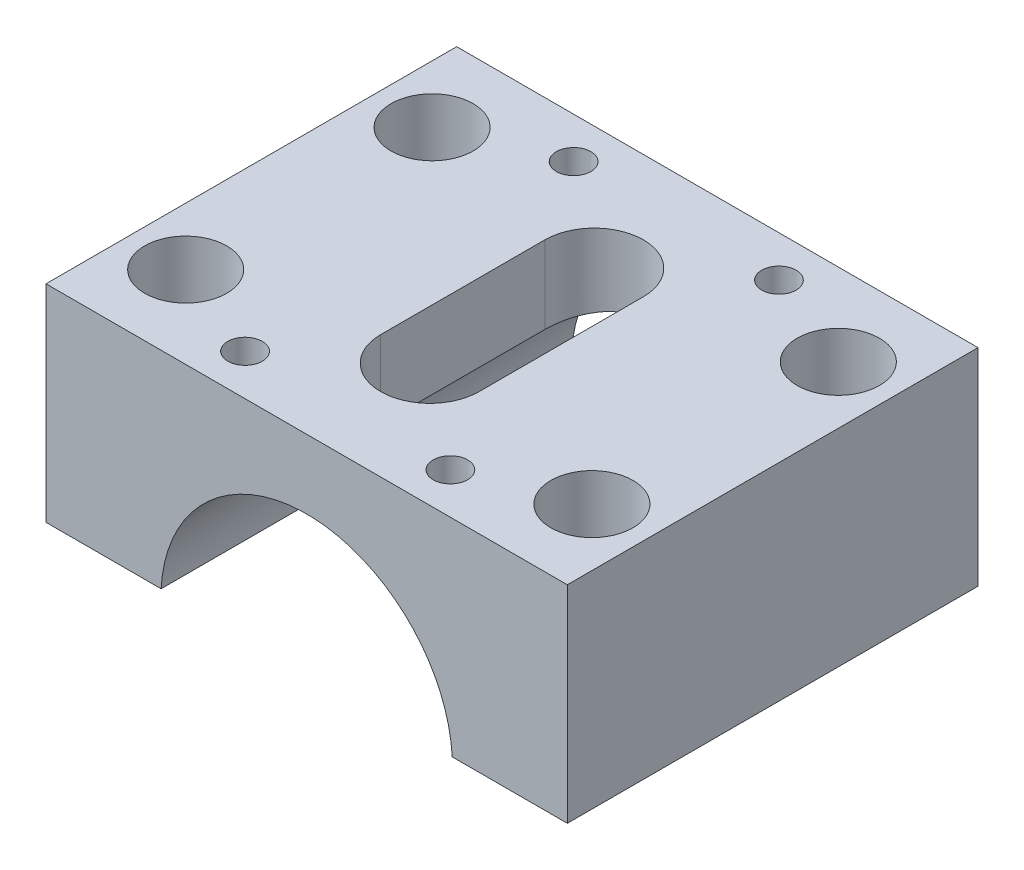
ISO-10303-21;
HEADER;
FILE_DESCRIPTION(('STEP AP214'),'2;1');
FILE_NAME('part.step','',(''),(''),'','','');
FILE_SCHEMA(('AUTOMOTIVE_DESIGN { 1 0 10303 214 1 1 1 1 }'));
ENDSEC;
DATA;
#1=APPLICATION_CONTEXT('core data for automotive mechanical design processes');
#2=APPLICATION_PROTOCOL_DEFINITION('international standard','automotive_design',2000,#1);
#3=PRODUCT_CONTEXT('',#1,'mechanical');
#4=PRODUCT('Part','Part','',(#3));
#5=PRODUCT_RELATED_PRODUCT_CATEGORY('part','',(#4));
#6=PRODUCT_DEFINITION_FORMATION('','',#4);
#7=PRODUCT_DEFINITION_CONTEXT('part definition',#1,'design');
#8=PRODUCT_DEFINITION('design','',#6,#7);
#9=PRODUCT_DEFINITION_SHAPE('','',#8);
#10=(LENGTH_UNIT() NAMED_UNIT(*) SI_UNIT(.MILLI.,.METRE.));
#11=(NAMED_UNIT(*) PLANE_ANGLE_UNIT() SI_UNIT($,.RADIAN.));
#12=(NAMED_UNIT(*) SI_UNIT($,.STERADIAN.) SOLID_ANGLE_UNIT());
#13=UNCERTAINTY_MEASURE_WITH_UNIT(LENGTH_MEASURE(1.E-05),#10,'distance_accuracy_value','');
#14=(GEOMETRIC_REPRESENTATION_CONTEXT(3) GLOBAL_UNCERTAINTY_ASSIGNED_CONTEXT((#13)) GLOBAL_UNIT_ASSIGNED_CONTEXT((#10,
#11,#12)) REPRESENTATION_CONTEXT('',''));
#15=CARTESIAN_POINT('',(0.,0.,0.));
#16=DIRECTION('',(0.,0.,1.));
#17=DIRECTION('',(1.,0.,0.));
#18=AXIS2_PLACEMENT_3D('',#15,#16,#17);
#19=CARTESIAN_POINT('',(-31.734248061046,1.,50.));
#20=DIRECTION('',(0.,1.,0.));
#21=DIRECTION('',(0.,0.,1.));
#22=AXIS2_PLACEMENT_3D('',#19,#20,#21);
#23=PLANE('',#22);
#24=CARTESIAN_POINT('',(-24.7280283297466,1.,10.));
#25=DIRECTION('',(0.,-1.,0.));
#26=DIRECTION('',(0.,0.,-1.));
#27=AXIS2_PLACEMENT_3D('',#24,#25,#26);
#28=CIRCLE('',#27,2.5);
#29=CARTESIAN_POINT('',(-24.7280283297466,1.,7.5));
#30=VERTEX_POINT('',#29);
#31=EDGE_CURVE('E382',#30,#30,#28,.T.);
#32=ORIENTED_EDGE('',*,*,#31,.F.);
#33=EDGE_LOOP('',(#32));
#34=FACE_BOUND('',#33,.T.);
#35=DIRECTION('',(1.,0.,0.));
#36=VECTOR('',#35,1.);
#37=CARTESIAN_POINT('',(-31.734248061046,1.,0.));
#38=LINE('',#37,#36);
#39=CARTESIAN_POINT('',(-31.734248061046,1.,0.));
#40=VERTEX_POINT('',#39);
#41=CARTESIAN_POINT('',(-17.7218085984473,0.999999999999997,0.));
#42=VERTEX_POINT('',#41);
#43=EDGE_CURVE('E339',#40,#42,#38,.T.);
#44=ORIENTED_EDGE('',*,*,#43,.T.);
#45=DIRECTION('',(0.,0.,-1.));
#46=VECTOR('',#45,1.);
#47=CARTESIAN_POINT('',(-17.7218085984473,0.999999999999997,50.));
#48=LINE('',#47,#46);
#49=CARTESIAN_POINT('',(-17.7218085984473,0.999999999999997,50.));
#50=VERTEX_POINT('',#49);
#51=EDGE_CURVE('E335',#50,#42,#48,.T.);
#52=ORIENTED_EDGE('',*,*,#51,.F.);
#53=DIRECTION('',(1.,0.,0.));
#54=VECTOR('',#53,1.);
#55=CARTESIAN_POINT('',(-31.734248061046,1.,50.));
#56=LINE('',#55,#54);
#57=CARTESIAN_POINT('',(-31.734248061046,1.,50.));
#58=VERTEX_POINT('',#57);
#59=EDGE_CURVE('E351',#58,#50,#56,.T.);
#60=ORIENTED_EDGE('',*,*,#59,.F.);
#61=DIRECTION('',(0.,0.,-1.));
#62=VECTOR('',#61,1.);
#63=CARTESIAN_POINT('',(-31.734248061046,1.,50.));
#64=LINE('',#63,#62);
#65=EDGE_CURVE('E67',#58,#40,#64,.T.);
#66=ORIENTED_EDGE('',*,*,#65,.T.);
#67=EDGE_LOOP('',(#44,#52,#60,#66));
#68=FACE_BOUND('',#67,.T.);
#69=CARTESIAN_POINT('',(-24.7280283297466,1.,40.));
#70=DIRECTION('',(0.,-1.,0.));
#71=DIRECTION('',(0.,0.,-1.));
#72=AXIS2_PLACEMENT_3D('',#69,#70,#71);
#73=CIRCLE('',#72,2.5);
#74=CARTESIAN_POINT('',(-24.7280283297466,1.,37.5));
#75=VERTEX_POINT('',#74);
#76=EDGE_CURVE('E385',#75,#75,#73,.T.);
#77=ORIENTED_EDGE('',*,*,#76,.F.);
#78=EDGE_LOOP('',(#77));
#79=FACE_BOUND('',#78,.T.);
#80=ADVANCED_FACE('F59',(#34,#68,#79),#23,.F.);
#81=CARTESIAN_POINT('',(0.,0.,50.));
#82=DIRECTION('',(0.,0.,-1.));
#83=DIRECTION('',(-1.,0.,0.));
#84=AXIS2_PLACEMENT_3D('',#81,#82,#83);
#85=CYLINDRICAL_SURFACE('',#84,17.75);
#86=DIRECTION('',(0.,0.,-1.));
#87=VECTOR('',#86,1.);
#88=CARTESIAN_POINT('',(-6.,16.7051638722881,50.));
#89=LINE('',#88,#87);
#90=CARTESIAN_POINT('',(-6.,16.7051638722881,35.));
#91=VERTEX_POINT('',#90);
#92=CARTESIAN_POINT('',(-6.,16.7051638722881,15.));
#93=VERTEX_POINT('',#92);
#94=EDGE_CURVE('E325',#91,#93,#89,.T.);
#95=ORIENTED_EDGE('',*,*,#94,.F.);
#96=CARTESIAN_POINT('',(6.,16.7051638722881,35.));
#97=CARTESIAN_POINT('',(6.00002342007143,16.7051365414949,35.1635480674207));
#98=CARTESIAN_POINT('',(5.99331409026112,16.7075647258007,35.3270857677742));
#99=CARTESIAN_POINT('',(5.96660432457967,16.7171320030722,35.652889514839));
#100=CARTESIAN_POINT('',(5.9466075678763,16.7242697919873,35.8151559009854));
#101=CARTESIAN_POINT('',(5.89357724858138,16.7430280345512,36.1367722796383));
#102=CARTESIAN_POINT('',(5.86058318341207,16.754634904753,36.2961295914589));
#103=CARTESIAN_POINT('',(5.78187292592793,16.7819602677661,36.6113118511021));
#104=CARTESIAN_POINT('',(5.73615625437459,16.7976789154596,36.7671366656224));
#105=CARTESIAN_POINT('',(5.63244556957572,16.8327372666503,37.0740731154286));
#106=CARTESIAN_POINT('',(5.5744618826778,16.8520739229428,37.225188593033));
#107=CARTESIAN_POINT('',(5.44664238090107,16.8938185798991,37.5219432584875));
#108=CARTESIAN_POINT('',(5.37680214225187,16.91622772633,37.6675803774535));
#109=CARTESIAN_POINT('',(5.22578838635883,16.963487061155,37.9524795941462));
#110=CARTESIAN_POINT('',(5.14461229712971,16.988337803141,38.0917402355688));
#111=CARTESIAN_POINT('',(4.97146486025809,17.0398120576225,38.363101586681));
#112=CARTESIAN_POINT('',(4.87948962832843,17.0664362064864,38.4951996949894));
#113=CARTESIAN_POINT('',(4.68183431450372,17.1217356884626,38.7560842050773));
#114=CARTESIAN_POINT('',(4.57577885881734,17.1504503813225,38.8845780067753));
#115=CARTESIAN_POINT('',(4.35340058577292,17.2082421789065,39.1322639179705));
#116=CARTESIAN_POINT('',(4.23707756316293,17.2373192908655,39.2514558414303));
#117=CARTESIAN_POINT('',(3.99483022450528,17.2950668741335,39.4798495696576));
#118=CARTESIAN_POINT('',(3.86890253979927,17.323737198549,39.5890478395198));
#119=CARTESIAN_POINT('',(3.60828257109103,17.3798894537477,39.7966701841972));
#120=CARTESIAN_POINT('',(3.47359335570537,17.4073717950536,39.8950979991787));
#121=CARTESIAN_POINT('',(3.19241700567326,17.4611572897031,40.0830945540191));
#122=CARTESIAN_POINT('',(3.04570771927342,17.4874074957652,40.1723466336045));
#123=CARTESIAN_POINT('',(2.74487413756477,17.5371433474165,40.3380844595887));
#124=CARTESIAN_POINT('',(2.59075285195165,17.5606301019936,40.4145753323143));
#125=CARTESIAN_POINT('',(2.27607126811911,17.6041821829219,40.554199575868));
#126=CARTESIAN_POINT('',(2.11550990140112,17.6242469385915,40.6173307191363));
#127=CARTESIAN_POINT('',(1.78920718040851,17.6603557164245,40.7296153246076));
#128=CARTESIAN_POINT('',(1.62346819757881,17.6764015498211,40.7787750847327));
#129=CARTESIAN_POINT('',(1.2939370559646,17.7035190514898,40.8611898531046));
#130=CARTESIAN_POINT('',(1.13028273867241,17.7147463284741,40.8949450909246));
#131=CARTESIAN_POINT('',(0.80055135890321,17.7327060439557,40.9486979167892));
#132=CARTESIAN_POINT('',(0.634475324305889,17.7394403358044,40.9687011776123));
#133=CARTESIAN_POINT('',(0.301111376380601,17.7482290372184,40.9947714589517));
#134=CARTESIAN_POINT('',(0.133823478621162,17.7502835067979,41.0008386581841));
#135=CARTESIAN_POINT('',(-0.200663382374875,17.7496535695884,40.9989751915117));
#136=CARTESIAN_POINT('',(-0.367862347639956,17.7469692759697,40.9910448598939));
#137=CARTESIAN_POINT('',(-0.694112668740136,17.7371434247946,40.9618733934276));
#138=CARTESIAN_POINT('',(-0.853219423674938,17.7301870755693,40.9411852081814));
#139=CARTESIAN_POINT('',(-1.16909348858325,17.7121640102108,40.8871811408754));
#140=CARTESIAN_POINT('',(-1.32585998992614,17.7010959060361,40.8538609944546));
#141=CARTESIAN_POINT('',(-1.63587502360733,17.6751408316399,40.7749018680635));
#142=CARTESIAN_POINT('',(-1.78912472668508,17.6602551529835,40.7292670541304));
#143=CARTESIAN_POINT('',(-2.09121751486416,17.6270363851067,40.6260376134251));
#144=CARTESIAN_POINT('',(-2.24005891220177,17.6087019947665,40.5684384719286));
#145=CARTESIAN_POINT('',(-2.53424365067538,17.5687913601538,40.4409229677589));
#146=CARTESIAN_POINT('',(-2.67951670042951,17.5471761971275,40.3708567117232));
#147=CARTESIAN_POINT('',(-2.96369547934685,17.5014208689384,40.219429228615));
#148=CARTESIAN_POINT('',(-3.10259900868277,17.4772798407298,40.1380641377931));
#149=CARTESIAN_POINT('',(-3.37318788302114,17.4270778264192,39.964617888958));
#150=CARTESIAN_POINT('',(-3.50487282999016,17.40101673463,39.8725361408997));
#151=CARTESIAN_POINT('',(-3.76027934111379,17.3476172519324,39.6782525140165));
#152=CARTESIAN_POINT('',(-3.88400060689633,17.3202788132324,39.5760502563741));
#153=CARTESIAN_POINT('',(-4.12858069572515,17.2636564200596,39.3569560161169));
#154=CARTESIAN_POINT('',(-4.24901026058293,17.2343423867391,39.2395921780816));
#155=CARTESIAN_POINT('',(-4.4795771268587,17.1758561337556,38.9951975716192));
#156=CARTESIAN_POINT('',(-4.58971762724468,17.1466838727062,38.8681698302272));
#157=CARTESIAN_POINT('',(-4.7991210603441,17.0892578880068,38.6050963977285));
#158=CARTESIAN_POINT('',(-4.89837631781216,17.0610048222342,38.4690444507081));
#159=CARTESIAN_POINT('',(-5.08520781892287,17.0062528863796,38.1888867436865));
#160=CARTESIAN_POINT('',(-5.17278861712651,16.9797533342425,38.0447841558055));
#161=CARTESIAN_POINT('',(-5.33697878779275,16.928870806327,37.7470028158934));
#162=CARTESIAN_POINT('',(-5.41338988724082,16.9045285462766,37.5932076240204));
#163=CARTESIAN_POINT('',(-5.55287251715026,16.8592255234493,37.2792752014284));
#164=CARTESIAN_POINT('',(-5.6159496138666,16.8382633505314,37.1191406503401));
#165=CARTESIAN_POINT('',(-5.72816785783277,16.8004197208411,36.7937864930715));
#166=CARTESIAN_POINT('',(-5.7773242610427,16.7835337998442,36.6285726752941));
#167=CARTESIAN_POINT('',(-5.86129010281429,16.7543948139634,36.2942095086042));
#168=CARTESIAN_POINT('',(-5.89610608361684,16.7421396367004,36.1250619915753));
#169=CARTESIAN_POINT('',(-5.94898531422032,16.7234218880272,35.7969109803414));
#170=CARTESIAN_POINT('',(-5.9681095355349,16.7165936842612,35.6380986103494));
#171=CARTESIAN_POINT('',(-5.9936190489736,16.7074552873122,35.3195282200375));
#172=CARTESIAN_POINT('',(-6.00002036822412,16.7051394099935,35.1597716440503));
#173=CARTESIAN_POINT('',(-6.,16.7051638722881,35.));
#174=B_SPLINE_CURVE_WITH_KNOTS('',3,(#96,#97,#98,#99,#100,#101,#102,#103,#104,#105,#106,#107,
#108,#109,#110,#111,#112,#113,#114,#115,#116,#117,#118,#119,#120,#121,#122,#123,#124,#125,#126,
#127,#128,#129,#130,#131,#132,#133,#134,#135,#136,#137,#138,#139,#140,#141,#142,#143,#144,#145,
#146,#147,#148,#149,#150,#151,#152,#153,#154,#155,#156,#157,#158,#159,#160,#161,#162,#163,#164,
#165,#166,#167,#168,#169,#170,#171,#172,#173),.UNSPECIFIED.,.F.,.F.,(4,2,2,2,2,2,2,2,2,2,2,2,2,
2,2,2,2,2,2,2,2,2,2,2,2,2,2,2,2,2,2,2,2,2,2,2,2,2,4),(0.,0.490472545918875,0.98080934100671,
1.4696674100072,1.95854389593631,2.4470104726231,2.93565970209931,3.42441998162882,
3.91335660245956,4.41997790163518,4.92660933062793,5.43341927568454,5.94005266276983,
6.46056872703177,6.98087518775703,7.50126833453608,8.02142652872063,8.5232210755085,
9.0248085044319,9.52638950096331,10.0279585189793,10.5091832820183,10.9905706442039,
11.4717953573418,11.9532019909966,12.4408448359006,12.9286548476749,13.4164917303464,
13.9043468799818,14.4158435133775,14.9271805846104,15.4388759152851,15.9503710301442,
16.4700615590999,16.9895347139059,17.5084363451177,18.0271009854307,18.5068497362949,
18.9859937603852),.UNSPECIFIED.);
#175=CARTESIAN_POINT('',(6.,16.7051638722881,35.));
#176=VERTEX_POINT('',#175);
#177=EDGE_CURVE('E229',#176,#91,#174,.T.);
#178=ORIENTED_EDGE('',*,*,#177,.F.);
#179=DIRECTION('',(0.,0.,-1.));
#180=VECTOR('',#179,1.);
#181=CARTESIAN_POINT('',(6.,16.7051638722881,50.));
#182=LINE('',#181,#180);
#183=CARTESIAN_POINT('',(6.,16.7051638722881,15.));
#184=VERTEX_POINT('',#183);
#185=EDGE_CURVE('E217',#184,#176,#182,.F.);
#186=ORIENTED_EDGE('',*,*,#185,.F.);
#187=CARTESIAN_POINT('',(-6.,16.7051638722881,15.));
#188=CARTESIAN_POINT('',(-6.00002342007143,16.7051365414949,14.8364519325793));
#189=CARTESIAN_POINT('',(-5.99331409026111,16.7075647258007,14.6729142322258));
#190=CARTESIAN_POINT('',(-5.96660432457967,16.7171320030722,14.347110485161));
#191=CARTESIAN_POINT('',(-5.9466075678763,16.7242697919873,14.1848440990146));
#192=CARTESIAN_POINT('',(-5.89357724858138,16.7430280345512,13.8632277203617));
#193=CARTESIAN_POINT('',(-5.86058318341206,16.754634904753,13.7038704085411));
#194=CARTESIAN_POINT('',(-5.78187292592793,16.7819602677661,13.3886881488979));
#195=CARTESIAN_POINT('',(-5.73615625437459,16.7976789154596,13.2328633343776));
#196=CARTESIAN_POINT('',(-5.63244556957572,16.8327372666503,12.9259268845714));
#197=CARTESIAN_POINT('',(-5.5744618826778,16.8520739229428,12.774811406967));
#198=CARTESIAN_POINT('',(-5.44664238090107,16.8938185798991,12.4780567415125));
#199=CARTESIAN_POINT('',(-5.37680214225186,16.91622772633,12.3324196225465));
#200=CARTESIAN_POINT('',(-5.22578838635882,16.963487061155,12.0475204058538));
#201=CARTESIAN_POINT('',(-5.14461229712971,16.988337803141,11.9082597644312));
#202=CARTESIAN_POINT('',(-4.97146486025808,17.0398120576225,11.636898413319));
#203=CARTESIAN_POINT('',(-4.87948962832842,17.0664362064864,11.5048003050106));
#204=CARTESIAN_POINT('',(-4.68183431450372,17.1217356884626,11.2439157949228));
#205=CARTESIAN_POINT('',(-4.57577885881734,17.1504503813225,11.1154219932247));
#206=CARTESIAN_POINT('',(-4.35340058577292,17.2082421789065,10.8677360820295));
#207=CARTESIAN_POINT('',(-4.23707756316292,17.2373192908655,10.7485441585697));
#208=CARTESIAN_POINT('',(-3.99483022450527,17.2950668741335,10.5201504303424));
#209=CARTESIAN_POINT('',(-3.86890253979926,17.323737198549,10.4109521604802));
#210=CARTESIAN_POINT('',(-3.60828257109102,17.3798894537477,10.2033298158028));
#211=CARTESIAN_POINT('',(-3.47359335570536,17.4073717950536,10.1049020008213));
#212=CARTESIAN_POINT('',(-3.19241700567326,17.4611572897031,9.91690544598085));
#213=CARTESIAN_POINT('',(-3.04570771927341,17.4874074957652,9.82765336639554));
#214=CARTESIAN_POINT('',(-2.74487413756477,17.5371433474165,9.66191554041129));
#215=CARTESIAN_POINT('',(-2.59075285195164,17.5606301019936,9.58542466768575));
#216=CARTESIAN_POINT('',(-2.2760712681191,17.6041821829219,9.44580042413195));
#217=CARTESIAN_POINT('',(-2.11550990140111,17.6242469385915,9.38266928086366));
#218=CARTESIAN_POINT('',(-1.7892071804085,17.6603557164245,9.27038467539244));
#219=CARTESIAN_POINT('',(-1.62346819757881,17.6764015498211,9.22122491526731));
#220=CARTESIAN_POINT('',(-1.29393705596459,17.7035190514898,9.13881014689541));
#221=CARTESIAN_POINT('',(-1.1302827386724,17.7147463284741,9.10505490907543));
#222=CARTESIAN_POINT('',(-0.800551358903203,17.7327060439557,9.05130208321085));
#223=CARTESIAN_POINT('',(-0.634475324305883,17.7394403358044,9.03129882238769));
#224=CARTESIAN_POINT('',(-0.301111376380595,17.7482290372184,9.00522854104826));
#225=CARTESIAN_POINT('',(-0.133823478621156,17.7502835067979,8.99916134181595));
#226=CARTESIAN_POINT('',(0.200663382374881,17.7496535695884,9.00102480848829));
#227=CARTESIAN_POINT('',(0.367862347639962,17.7469692759697,9.00895514010612));
#228=CARTESIAN_POINT('',(0.694112668740141,17.7371434247946,9.03812660657236));
#229=CARTESIAN_POINT('',(0.853219423674942,17.7301870755693,9.05881479181859));
#230=CARTESIAN_POINT('',(1.16909348858325,17.7121640102108,9.11281885912462));
#231=CARTESIAN_POINT('',(1.32585998992615,17.7010959060361,9.14613900554543));
#232=CARTESIAN_POINT('',(1.63587502360733,17.6751408316399,9.22509813193652));
#233=CARTESIAN_POINT('',(1.78912472668509,17.6602551529835,9.27073294586959));
#234=CARTESIAN_POINT('',(2.09121751486416,17.6270363851067,9.37396238657486));
#235=CARTESIAN_POINT('',(2.24005891220178,17.6087019947665,9.43156152807137));
#236=CARTESIAN_POINT('',(2.53424365067538,17.5687913601538,9.55907703224106));
#237=CARTESIAN_POINT('',(2.67951670042951,17.5471761971275,9.6291432882768));
#238=CARTESIAN_POINT('',(2.96369547934686,17.5014208689383,9.78057077138503));
#239=CARTESIAN_POINT('',(3.10259900868277,17.4772798407298,9.86193586220694));
#240=CARTESIAN_POINT('',(3.37318788302114,17.4270778264192,10.035382111042));
#241=CARTESIAN_POINT('',(3.50487282999016,17.40101673463,10.1274638591003));
#242=CARTESIAN_POINT('',(3.76027934111379,17.3476172519324,10.3217474859835));
#243=CARTESIAN_POINT('',(3.88400060689633,17.3202788132324,10.4239497436259));
#244=CARTESIAN_POINT('',(4.12858069572516,17.2636564200596,10.6430439838831));
#245=CARTESIAN_POINT('',(4.24901026058293,17.2343423867391,10.7604078219184));
#246=CARTESIAN_POINT('',(4.4795771268587,17.1758561337556,11.0048024283808));
#247=CARTESIAN_POINT('',(4.58971762724468,17.1466838727062,11.1318301697728));
#248=CARTESIAN_POINT('',(4.7991210603441,17.0892578880068,11.3949036022715));
#249=CARTESIAN_POINT('',(4.89837631781216,17.0610048222342,11.5309555492919));
#250=CARTESIAN_POINT('',(5.08520781892287,17.0062528863796,11.8111132563135));
#251=CARTESIAN_POINT('',(5.17278861712651,16.9797533342425,11.9552158441945));
#252=CARTESIAN_POINT('',(5.33697878779275,16.928870806327,12.2529971841066));
#253=CARTESIAN_POINT('',(5.41338988724082,16.9045285462766,12.4067923759796));
#254=CARTESIAN_POINT('',(5.55287251715026,16.8592255234493,12.7207247985716));
#255=CARTESIAN_POINT('',(5.6159496138666,16.8382633505314,12.88085934966));
#256=CARTESIAN_POINT('',(5.72816785783278,16.8004197208411,13.2062135069285));
#257=CARTESIAN_POINT('',(5.77732426104271,16.7835337998442,13.3714273247059));
#258=CARTESIAN_POINT('',(5.86129010281429,16.7543948139634,13.7057904913958));
#259=CARTESIAN_POINT('',(5.89610608361684,16.7421396367004,13.8749380084247));
#260=CARTESIAN_POINT('',(5.94898531422033,16.7234218880272,14.2030890196586));
#261=CARTESIAN_POINT('',(5.96810953553491,16.7165936842612,14.3619013896507));
#262=CARTESIAN_POINT('',(5.9936190489736,16.7074552873122,14.6804717799625));
#263=CARTESIAN_POINT('',(6.00002036822413,16.7051394099935,14.8402283559497));
#264=CARTESIAN_POINT('',(6.,16.7051638722881,15.));
#265=B_SPLINE_CURVE_WITH_KNOTS('',3,(#187,#188,#189,#190,#191,#192,#193,#194,#195,#196,#197,
#198,#199,#200,#201,#202,#203,#204,#205,#206,#207,#208,#209,#210,#211,#212,#213,#214,#215,#216,
#217,#218,#219,#220,#221,#222,#223,#224,#225,#226,#227,#228,#229,#230,#231,#232,#233,#234,#235,
#236,#237,#238,#239,#240,#241,#242,#243,#244,#245,#246,#247,#248,#249,#250,#251,#252,#253,#254,
#255,#256,#257,#258,#259,#260,#261,#262,#263,#264),.UNSPECIFIED.,.F.,.F.,(4,2,2,2,2,2,2,2,2,2,2,
2,2,2,2,2,2,2,2,2,2,2,2,2,2,2,2,2,2,2,2,2,2,2,2,2,2,2,4),(0.,0.49047254591887,0.98080934100671,
1.4696674100072,1.95854389593631,2.4470104726231,2.93565970209932,3.42441998162883,
3.91335660245955,4.41997790163518,4.92660933062793,5.43341927568454,5.94005266276983,
6.46056872703178,6.98087518775703,7.50126833453609,8.02142652872063,8.5232210755085,
9.02480850443191,9.52638950096331,10.0279585189793,10.5091832820183,10.9905706442039,
11.4717953573418,11.9532019909966,12.4408448359006,12.9286548476749,13.4164917303464,
13.9043468799818,14.4158435133775,14.9271805846104,15.4388759152851,15.9503710301442,
16.4700615590999,16.9895347139059,17.5084363451177,18.0271009854307,18.5068497362949,
18.9859937603852),.UNSPECIFIED.);
#266=EDGE_CURVE('E208',#93,#184,#265,.T.);
#267=ORIENTED_EDGE('',*,*,#266,.F.);
#268=EDGE_LOOP('',(#95,#178,#186,#267));
#269=FACE_BOUND('',#268,.T.);
#270=CARTESIAN_POINT('',(0.,0.,0.));
#271=DIRECTION('',(0.,0.,-1.));
#272=DIRECTION('',(1.,0.,0.));
#273=AXIS2_PLACEMENT_3D('',#270,#271,#272);
#274=CIRCLE('',#273,17.75);
#275=CARTESIAN_POINT('',(17.7218085984473,1.,0.));
#276=VERTEX_POINT('',#275);
#277=EDGE_CURVE('E329',#42,#276,#274,.T.);
#278=ORIENTED_EDGE('',*,*,#277,.T.);
#279=DIRECTION('',(0.,0.,-1.));
#280=VECTOR('',#279,1.);
#281=CARTESIAN_POINT('',(17.7218085984473,1.,50.));
#282=LINE('',#281,#280);
#283=CARTESIAN_POINT('',(17.7218085984473,1.,50.));
#284=VERTEX_POINT('',#283);
#285=EDGE_CURVE('E332',#284,#276,#282,.T.);
#286=ORIENTED_EDGE('',*,*,#285,.F.);
#287=CARTESIAN_POINT('',(0.,0.,50.));
#288=DIRECTION('',(0.,0.,-1.));
#289=DIRECTION('',(1.,0.,0.));
#290=AXIS2_PLACEMENT_3D('',#287,#288,#289);
#291=CIRCLE('',#290,17.75);
#292=EDGE_CURVE('E353',#50,#284,#291,.T.);
#293=ORIENTED_EDGE('',*,*,#292,.F.);
#294=ORIENTED_EDGE('',*,*,#51,.T.);
#295=EDGE_LOOP('',(#278,#286,#293,#294));
#296=FACE_BOUND('',#295,.T.);
#297=ADVANCED_FACE('F312',(#269,#296),#85,.F.);
#298=CARTESIAN_POINT('',(17.7218085984473,1.,50.));
#299=DIRECTION('',(0.,1.,0.));
#300=DIRECTION('',(0.,0.,1.));
#301=AXIS2_PLACEMENT_3D('',#298,#299,#300);
#302=PLANE('',#301);
#303=CARTESIAN_POINT('',(24.7280283297466,1.,40.));
#304=DIRECTION('',(0.,-1.,0.));
#305=DIRECTION('',(0.,0.,-1.));
#306=AXIS2_PLACEMENT_3D('',#303,#304,#305);
#307=CIRCLE('',#306,2.5);
#308=CARTESIAN_POINT('',(24.7280283297466,1.,37.5));
#309=VERTEX_POINT('',#308);
#310=EDGE_CURVE('E379',#309,#309,#307,.T.);
#311=ORIENTED_EDGE('',*,*,#310,.F.);
#312=EDGE_LOOP('',(#311));
#313=FACE_BOUND('',#312,.T.);
#314=CARTESIAN_POINT('',(24.7280283297466,1.,10.0000000000001));
#315=DIRECTION('',(0.,-1.,0.));
#316=DIRECTION('',(0.,0.,-1.));
#317=AXIS2_PLACEMENT_3D('',#314,#315,#316);
#318=CIRCLE('',#317,2.5);
#319=CARTESIAN_POINT('',(24.7280283297466,1.,7.50000000000006));
#320=VERTEX_POINT('',#319);
#321=EDGE_CURVE('E376',#320,#320,#318,.T.);
#322=ORIENTED_EDGE('',*,*,#321,.F.);
#323=EDGE_LOOP('',(#322));
#324=FACE_BOUND('',#323,.T.);
#325=DIRECTION('',(1.,0.,0.));
#326=VECTOR('',#325,1.);
#327=CARTESIAN_POINT('',(17.7218085984473,1.,0.));
#328=LINE('',#327,#326);
#329=CARTESIAN_POINT('',(31.734248061046,1.,0.));
#330=VERTEX_POINT('',#329);
#331=EDGE_CURVE('E338',#276,#330,#328,.T.);
#332=ORIENTED_EDGE('',*,*,#331,.T.);
#333=DIRECTION('',(0.,0.,-1.));
#334=VECTOR('',#333,1.);
#335=CARTESIAN_POINT('',(31.734248061046,1.,50.));
#336=LINE('',#335,#334);
#337=CARTESIAN_POINT('',(31.734248061046,1.,50.));
#338=VERTEX_POINT('',#337);
#339=EDGE_CURVE('E346',#338,#330,#336,.T.);
#340=ORIENTED_EDGE('',*,*,#339,.F.);
#341=DIRECTION('',(1.,0.,0.));
#342=VECTOR('',#341,1.);
#343=CARTESIAN_POINT('',(17.7218085984473,1.,50.));
#344=LINE('',#343,#342);
#345=EDGE_CURVE('E345',#284,#338,#344,.T.);
#346=ORIENTED_EDGE('',*,*,#345,.F.);
#347=ORIENTED_EDGE('',*,*,#285,.T.);
#348=EDGE_LOOP('',(#332,#340,#346,#347));
#349=FACE_BOUND('',#348,.T.);
#350=ADVANCED_FACE('F306',(#313,#324,#349),#302,.F.);
#351=CARTESIAN_POINT('',(0.,0.,50.));
#352=DIRECTION('',(0.,0.,1.));
#353=DIRECTION('',(1.,0.,0.));
#354=AXIS2_PLACEMENT_3D('',#351,#352,#353);
#355=PLANE('',#354);
#356=DIRECTION('',(1.,0.,0.));
#357=VECTOR('',#356,1.);
#358=CARTESIAN_POINT('',(0.,26.154588507564,50.));
#359=LINE('',#358,#357);
#360=CARTESIAN_POINT('',(-31.734248061046,26.154588507564,50.));
#361=VERTEX_POINT('',#360);
#362=CARTESIAN_POINT('',(31.734248061046,26.154588507564,50.));
#363=VERTEX_POINT('',#362);
#364=EDGE_CURVE('E74',#361,#363,#359,.T.);
#365=ORIENTED_EDGE('',*,*,#364,.F.);
#366=DIRECTION('',(0.,1.,0.));
#367=VECTOR('',#366,1.);
#368=CARTESIAN_POINT('',(-31.734248061046,0.,50.));
#369=LINE('',#368,#367);
#370=EDGE_CURVE('E366',#58,#361,#369,.T.);
#371=ORIENTED_EDGE('',*,*,#370,.F.);
#372=ORIENTED_EDGE('',*,*,#59,.T.);
#373=ORIENTED_EDGE('',*,*,#292,.T.);
#374=ORIENTED_EDGE('',*,*,#345,.T.);
#375=DIRECTION('',(0.,1.,0.));
#376=VECTOR('',#375,1.);
#377=CARTESIAN_POINT('',(31.734248061046,0.,50.));
#378=LINE('',#377,#376);
#379=EDGE_CURVE('E373',#338,#363,#378,.T.);
#380=ORIENTED_EDGE('',*,*,#379,.T.);
#381=EDGE_LOOP('',(#365,#371,#372,#373,#374,#380));
#382=FACE_BOUND('',#381,.T.);
#383=ADVANCED_FACE('F303',(#382),#355,.T.);
#384=CARTESIAN_POINT('',(0.,0.,0.));
#385=DIRECTION('',(0.,0.,1.));
#386=DIRECTION('',(1.,0.,0.));
#387=AXIS2_PLACEMENT_3D('',#384,#385,#386);
#388=PLANE('',#387);
#389=DIRECTION('',(0.,-1.,0.));
#390=VECTOR('',#389,1.);
#391=CARTESIAN_POINT('',(-31.734248061046,0.,0.));
#392=LINE('',#391,#390);
#393=CARTESIAN_POINT('',(-31.734248061046,26.154588507564,0.));
#394=VERTEX_POINT('',#393);
#395=EDGE_CURVE('E364',#394,#40,#392,.T.);
#396=ORIENTED_EDGE('',*,*,#395,.F.);
#397=DIRECTION('',(1.,0.,0.));
#398=VECTOR('',#397,1.);
#399=CARTESIAN_POINT('',(0.,26.154588507564,0.));
#400=LINE('',#399,#398);
#401=CARTESIAN_POINT('',(31.734248061046,26.154588507564,0.));
#402=VERTEX_POINT('',#401);
#403=EDGE_CURVE('E179',#394,#402,#400,.T.);
#404=ORIENTED_EDGE('',*,*,#403,.T.);
#405=DIRECTION('',(0.,-1.,0.));
#406=VECTOR('',#405,1.);
#407=CARTESIAN_POINT('',(31.734248061046,0.,0.));
#408=LINE('',#407,#406);
#409=EDGE_CURVE('E350',#402,#330,#408,.T.);
#410=ORIENTED_EDGE('',*,*,#409,.T.);
#411=ORIENTED_EDGE('',*,*,#331,.F.);
#412=ORIENTED_EDGE('',*,*,#277,.F.);
#413=ORIENTED_EDGE('',*,*,#43,.F.);
#414=EDGE_LOOP('',(#396,#404,#410,#411,#412,#413));
#415=FACE_BOUND('',#414,.T.);
#416=ADVANCED_FACE('F301',(#415),#388,.F.);
#417=CARTESIAN_POINT('',(-31.734248061046,0.,-44.1885166078247));
#418=DIRECTION('',(1.,0.,0.));
#419=DIRECTION('',(0.,0.,-1.));
#420=AXIS2_PLACEMENT_3D('',#417,#418,#419);
#421=PLANE('',#420);
#422=ORIENTED_EDGE('',*,*,#370,.T.);
#423=DIRECTION('',(0.,0.,1.));
#424=VECTOR('',#423,1.);
#425=CARTESIAN_POINT('',(-31.734248061046,26.154588507564,0.));
#426=LINE('',#425,#424);
#427=EDGE_CURVE('E182',#394,#361,#426,.T.);
#428=ORIENTED_EDGE('',*,*,#427,.F.);
#429=ORIENTED_EDGE('',*,*,#395,.T.);
#430=ORIENTED_EDGE('',*,*,#65,.F.);
#431=EDGE_LOOP('',(#422,#428,#429,#430));
#432=FACE_BOUND('',#431,.T.);
#433=ADVANCED_FACE('F297',(#432),#421,.F.);
#434=CARTESIAN_POINT('',(31.734248061046,0.,-44.1885166078247));
#435=DIRECTION('',(1.,0.,0.));
#436=DIRECTION('',(0.,0.,-1.));
#437=AXIS2_PLACEMENT_3D('',#434,#435,#436);
#438=PLANE('',#437);
#439=DIRECTION('',(0.,0.,1.));
#440=VECTOR('',#439,1.);
#441=CARTESIAN_POINT('',(31.734248061046,26.154588507564,0.));
#442=LINE('',#441,#440);
#443=EDGE_CURVE('E184',#402,#363,#442,.T.);
#444=ORIENTED_EDGE('',*,*,#443,.T.);
#445=ORIENTED_EDGE('',*,*,#379,.F.);
#446=ORIENTED_EDGE('',*,*,#339,.T.);
#447=ORIENTED_EDGE('',*,*,#409,.F.);
#448=EDGE_LOOP('',(#444,#445,#446,#447));
#449=FACE_BOUND('',#448,.T.);
#450=ADVANCED_FACE('F293',(#449),#438,.T.);
#451=CARTESIAN_POINT('',(24.7280283297466,1.,10.0000000000001));
#452=DIRECTION('',(0.,-1.,0.));
#453=DIRECTION('',(0.,0.,-1.));
#454=AXIS2_PLACEMENT_3D('',#451,#452,#453);
#455=CYLINDRICAL_SURFACE('',#454,2.5);
#456=CARTESIAN_POINT('',(24.7280283297466,4.,10.0000000000001));
#457=DIRECTION('',(0.,-1.,0.));
#458=DIRECTION('',(0.,0.,-1.));
#459=AXIS2_PLACEMENT_3D('',#456,#457,#458);
#460=CIRCLE('',#459,2.5);
#461=CARTESIAN_POINT('',(24.7280283297466,4.,7.50000000000006));
#462=VERTEX_POINT('',#461);
#463=EDGE_CURVE('E402',#462,#462,#460,.T.);
#464=ORIENTED_EDGE('',*,*,#463,.F.);
#465=EDGE_LOOP('',(#464));
#466=FACE_BOUND('',#465,.T.);
#467=ORIENTED_EDGE('',*,*,#321,.T.);
#468=EDGE_LOOP('',(#467));
#469=FACE_BOUND('',#468,.T.);
#470=ADVANCED_FACE('F289',(#466,#469),#455,.F.);
#471=CARTESIAN_POINT('',(24.7280283297466,1.,40.));
#472=DIRECTION('',(0.,-1.,0.));
#473=DIRECTION('',(0.,0.,-1.));
#474=AXIS2_PLACEMENT_3D('',#471,#472,#473);
#475=CYLINDRICAL_SURFACE('',#474,2.5);
#476=CARTESIAN_POINT('',(24.7280283297466,4.,40.));
#477=DIRECTION('',(0.,-1.,0.));
#478=DIRECTION('',(0.,0.,-1.));
#479=AXIS2_PLACEMENT_3D('',#476,#477,#478);
#480=CIRCLE('',#479,2.5);
#481=CARTESIAN_POINT('',(24.7280283297466,4.,37.5));
#482=VERTEX_POINT('',#481);
#483=EDGE_CURVE('E395',#482,#482,#480,.T.);
#484=ORIENTED_EDGE('',*,*,#483,.F.);
#485=EDGE_LOOP('',(#484));
#486=FACE_BOUND('',#485,.T.);
#487=ORIENTED_EDGE('',*,*,#310,.T.);
#488=EDGE_LOOP('',(#487));
#489=FACE_BOUND('',#488,.T.);
#490=ADVANCED_FACE('F285',(#486,#489),#475,.F.);
#491=CARTESIAN_POINT('',(-24.7280283297466,1.,10.));
#492=DIRECTION('',(0.,-1.,0.));
#493=DIRECTION('',(0.,0.,-1.));
#494=AXIS2_PLACEMENT_3D('',#491,#492,#493);
#495=CYLINDRICAL_SURFACE('',#494,2.5);
#496=CARTESIAN_POINT('',(-24.7280283297466,4.,10.));
#497=DIRECTION('',(0.,-1.,0.));
#498=DIRECTION('',(0.,0.,-1.));
#499=AXIS2_PLACEMENT_3D('',#496,#497,#498);
#500=CIRCLE('',#499,2.5);
#501=CARTESIAN_POINT('',(-24.7280283297466,4.,7.50000000000001));
#502=VERTEX_POINT('',#501);
#503=EDGE_CURVE('E394',#502,#502,#500,.T.);
#504=ORIENTED_EDGE('',*,*,#503,.F.);
#505=EDGE_LOOP('',(#504));
#506=FACE_BOUND('',#505,.T.);
#507=ORIENTED_EDGE('',*,*,#31,.T.);
#508=EDGE_LOOP('',(#507));
#509=FACE_BOUND('',#508,.T.);
#510=ADVANCED_FACE('F281',(#506,#509),#495,.F.);
#511=CARTESIAN_POINT('',(-24.7280283297466,1.,40.));
#512=DIRECTION('',(0.,-1.,0.));
#513=DIRECTION('',(0.,0.,-1.));
#514=AXIS2_PLACEMENT_3D('',#511,#512,#513);
#515=CYLINDRICAL_SURFACE('',#514,2.5);
#516=CARTESIAN_POINT('',(-24.7280283297466,4.,40.));
#517=DIRECTION('',(0.,-1.,0.));
#518=DIRECTION('',(0.,0.,-1.));
#519=AXIS2_PLACEMENT_3D('',#516,#517,#518);
#520=CIRCLE('',#519,2.5);
#521=CARTESIAN_POINT('',(-24.7280283297466,4.,37.5));
#522=VERTEX_POINT('',#521);
#523=EDGE_CURVE('E388',#522,#522,#520,.T.);
#524=ORIENTED_EDGE('',*,*,#523,.F.);
#525=EDGE_LOOP('',(#524));
#526=FACE_BOUND('',#525,.T.);
#527=ORIENTED_EDGE('',*,*,#76,.T.);
#528=EDGE_LOOP('',(#527));
#529=FACE_BOUND('',#528,.T.);
#530=ADVANCED_FACE('F277',(#526,#529),#515,.F.);
#531=CARTESIAN_POINT('',(-24.7280283297466,31.751,40.));
#532=DIRECTION('',(0.,-1.,0.));
#533=DIRECTION('',(0.,0.,-1.));
#534=AXIS2_PLACEMENT_3D('',#531,#532,#533);
#535=CYLINDRICAL_SURFACE('',#534,5.);
#536=CARTESIAN_POINT('',(-24.7280283297466,26.154588507564,40.));
#537=DIRECTION('',(0.,-1.,0.));
#538=DIRECTION('',(0.,0.,-1.));
#539=AXIS2_PLACEMENT_3D('',#536,#537,#538);
#540=CIRCLE('',#539,5.);
#541=CARTESIAN_POINT('',(-24.7280283297466,26.154588507564,35.));
#542=VERTEX_POINT('',#541);
#543=EDGE_CURVE('E205',#542,#542,#540,.F.);
#544=ORIENTED_EDGE('',*,*,#543,.T.);
#545=EDGE_LOOP('',(#544));
#546=FACE_BOUND('',#545,.T.);
#547=CARTESIAN_POINT('',(-24.7280283297466,4.,40.));
#548=DIRECTION('',(0.,-1.,0.));
#549=DIRECTION('',(0.,0.,-1.));
#550=AXIS2_PLACEMENT_3D('',#547,#548,#549);
#551=CIRCLE('',#550,5.);
#552=CARTESIAN_POINT('',(-24.7280283297466,4.,35.));
#553=VERTEX_POINT('',#552);
#554=EDGE_CURVE('E391',#553,#553,#551,.T.);
#555=ORIENTED_EDGE('',*,*,#554,.T.);
#556=EDGE_LOOP('',(#555));
#557=FACE_BOUND('',#556,.T.);
#558=ADVANCED_FACE('F273',(#546,#557),#535,.F.);
#559=CARTESIAN_POINT('',(-24.7280283297466,4.,40.));
#560=DIRECTION('',(0.,-1.,0.));
#561=DIRECTION('',(0.,0.,-1.));
#562=AXIS2_PLACEMENT_3D('',#559,#560,#561);
#563=PLANE('',#562);
#564=ORIENTED_EDGE('',*,*,#523,.T.);
#565=EDGE_LOOP('',(#564));
#566=FACE_BOUND('',#565,.T.);
#567=ORIENTED_EDGE('',*,*,#554,.F.);
#568=EDGE_LOOP('',(#567));
#569=FACE_BOUND('',#568,.T.);
#570=ADVANCED_FACE('F255',(#566,#569),#563,.F.);
#571=CARTESIAN_POINT('',(-24.7280283297466,31.751,10.));
#572=DIRECTION('',(0.,-1.,0.));
#573=DIRECTION('',(0.,0.,-1.));
#574=AXIS2_PLACEMENT_3D('',#571,#572,#573);
#575=CYLINDRICAL_SURFACE('',#574,5.);
#576=CARTESIAN_POINT('',(-24.7280283297466,26.154588507564,10.));
#577=DIRECTION('',(0.,-1.,0.));
#578=DIRECTION('',(0.,0.,-1.));
#579=AXIS2_PLACEMENT_3D('',#576,#577,#578);
#580=CIRCLE('',#579,5.);
#581=CARTESIAN_POINT('',(-24.7280283297466,26.154588507564,5.));
#582=VERTEX_POINT('',#581);
#583=EDGE_CURVE('E201',#582,#582,#580,.F.);
#584=ORIENTED_EDGE('',*,*,#583,.T.);
#585=EDGE_LOOP('',(#584));
#586=FACE_BOUND('',#585,.T.);
#587=CARTESIAN_POINT('',(-24.7280283297466,4.,10.));
#588=DIRECTION('',(0.,-1.,0.));
#589=DIRECTION('',(0.,0.,-1.));
#590=AXIS2_PLACEMENT_3D('',#587,#588,#589);
#591=CIRCLE('',#590,5.);
#592=CARTESIAN_POINT('',(-24.7280283297466,4.,5.));
#593=VERTEX_POINT('',#592);
#594=EDGE_CURVE('E405',#593,#593,#591,.T.);
#595=ORIENTED_EDGE('',*,*,#594,.T.);
#596=EDGE_LOOP('',(#595));
#597=FACE_BOUND('',#596,.T.);
#598=ADVANCED_FACE('F251',(#586,#597),#575,.F.);
#599=CARTESIAN_POINT('',(-24.7280283297466,4.,10.));
#600=DIRECTION('',(0.,-1.,0.));
#601=DIRECTION('',(0.,0.,-1.));
#602=AXIS2_PLACEMENT_3D('',#599,#600,#601);
#603=PLANE('',#602);
#604=ORIENTED_EDGE('',*,*,#503,.T.);
#605=EDGE_LOOP('',(#604));
#606=FACE_BOUND('',#605,.T.);
#607=ORIENTED_EDGE('',*,*,#594,.F.);
#608=EDGE_LOOP('',(#607));
#609=FACE_BOUND('',#608,.T.);
#610=ADVANCED_FACE('F247',(#606,#609),#603,.F.);
#611=CARTESIAN_POINT('',(24.7280283297466,31.751,40.));
#612=DIRECTION('',(0.,-1.,0.));
#613=DIRECTION('',(0.,0.,-1.));
#614=AXIS2_PLACEMENT_3D('',#611,#612,#613);
#615=CYLINDRICAL_SURFACE('',#614,5.);
#616=CARTESIAN_POINT('',(24.7280283297466,26.154588507564,40.));
#617=DIRECTION('',(0.,-1.,0.));
#618=DIRECTION('',(0.,0.,-1.));
#619=AXIS2_PLACEMENT_3D('',#616,#617,#618);
#620=CIRCLE('',#619,5.);
#621=CARTESIAN_POINT('',(24.7280283297466,26.154588507564,35.));
#622=VERTEX_POINT('',#621);
#623=EDGE_CURVE('E198',#622,#622,#620,.F.);
#624=ORIENTED_EDGE('',*,*,#623,.T.);
#625=EDGE_LOOP('',(#624));
#626=FACE_BOUND('',#625,.T.);
#627=CARTESIAN_POINT('',(24.7280283297466,4.,40.));
#628=DIRECTION('',(0.,-1.,0.));
#629=DIRECTION('',(0.,0.,-1.));
#630=AXIS2_PLACEMENT_3D('',#627,#628,#629);
#631=CIRCLE('',#630,5.);
#632=CARTESIAN_POINT('',(24.7280283297466,4.,35.));
#633=VERTEX_POINT('',#632);
#634=EDGE_CURVE('E399',#633,#633,#631,.T.);
#635=ORIENTED_EDGE('',*,*,#634,.T.);
#636=EDGE_LOOP('',(#635));
#637=FACE_BOUND('',#636,.T.);
#638=ADVANCED_FACE('F250',(#626,#637),#615,.F.);
#639=CARTESIAN_POINT('',(24.7280283297466,4.,40.));
#640=DIRECTION('',(0.,-1.,0.));
#641=DIRECTION('',(0.,0.,-1.));
#642=AXIS2_PLACEMENT_3D('',#639,#640,#641);
#643=PLANE('',#642);
#644=ORIENTED_EDGE('',*,*,#483,.T.);
#645=EDGE_LOOP('',(#644));
#646=FACE_BOUND('',#645,.T.);
#647=ORIENTED_EDGE('',*,*,#634,.F.);
#648=EDGE_LOOP('',(#647));
#649=FACE_BOUND('',#648,.T.);
#650=ADVANCED_FACE('F263',(#646,#649),#643,.F.);
#651=CARTESIAN_POINT('',(24.7280283297466,31.751,10.0000000000001));
#652=DIRECTION('',(0.,-1.,0.));
#653=DIRECTION('',(0.,0.,-1.));
#654=AXIS2_PLACEMENT_3D('',#651,#652,#653);
#655=CYLINDRICAL_SURFACE('',#654,5.);
#656=CARTESIAN_POINT('',(24.7280283297466,26.154588507564,10.0000000000001));
#657=DIRECTION('',(0.,-1.,0.));
#658=DIRECTION('',(0.,0.,-1.));
#659=AXIS2_PLACEMENT_3D('',#656,#657,#658);
#660=CIRCLE('',#659,5.);
#661=CARTESIAN_POINT('',(24.7280283297466,26.154588507564,5.00000000000006));
#662=VERTEX_POINT('',#661);
#663=EDGE_CURVE('E195',#662,#662,#660,.F.);
#664=ORIENTED_EDGE('',*,*,#663,.T.);
#665=EDGE_LOOP('',(#664));
#666=FACE_BOUND('',#665,.T.);
#667=CARTESIAN_POINT('',(24.7280283297466,4.,10.0000000000001));
#668=DIRECTION('',(0.,-1.,0.));
#669=DIRECTION('',(0.,0.,-1.));
#670=AXIS2_PLACEMENT_3D('',#667,#668,#669);
#671=CIRCLE('',#670,5.);
#672=CARTESIAN_POINT('',(24.7280283297466,4.,5.00000000000006));
#673=VERTEX_POINT('',#672);
#674=EDGE_CURVE('E398',#673,#673,#671,.T.);
#675=ORIENTED_EDGE('',*,*,#674,.T.);
#676=EDGE_LOOP('',(#675));
#677=FACE_BOUND('',#676,.T.);
#678=ADVANCED_FACE('F259',(#666,#677),#655,.F.);
#679=CARTESIAN_POINT('',(24.7280283297466,4.,10.0000000000001));
#680=DIRECTION('',(0.,-1.,0.));
#681=DIRECTION('',(0.,0.,-1.));
#682=AXIS2_PLACEMENT_3D('',#679,#680,#681);
#683=PLANE('',#682);
#684=ORIENTED_EDGE('',*,*,#463,.T.);
#685=EDGE_LOOP('',(#684));
#686=FACE_BOUND('',#685,.T.);
#687=ORIENTED_EDGE('',*,*,#674,.F.);
#688=EDGE_LOOP('',(#687));
#689=FACE_BOUND('',#688,.T.);
#690=ADVANCED_FACE('F244',(#686,#689),#683,.F.);
#691=CARTESIAN_POINT('',(0.,31.751,35.));
#692=DIRECTION('',(0.,-1.,0.));
#693=DIRECTION('',(0.,0.,-1.));
#694=AXIS2_PLACEMENT_3D('',#691,#692,#693);
#695=CYLINDRICAL_SURFACE('',#694,6.);
#696=DIRECTION('',(0.,-1.,0.));
#697=VECTOR('',#696,1.);
#698=CARTESIAN_POINT('',(-6.,31.751,35.));
#699=LINE('',#698,#697);
#700=CARTESIAN_POINT('',(-6.,26.154588507564,35.));
#701=VERTEX_POINT('',#700);
#702=EDGE_CURVE('E237',#701,#91,#699,.T.);
#703=ORIENTED_EDGE('',*,*,#702,.F.);
#704=CARTESIAN_POINT('',(0.,26.154588507564,35.));
#705=DIRECTION('',(0.,-1.,0.));
#706=DIRECTION('',(0.,0.,-1.));
#707=AXIS2_PLACEMENT_3D('',#704,#705,#706);
#708=CIRCLE('',#707,6.);
#709=CARTESIAN_POINT('',(6.,26.154588507564,35.));
#710=VERTEX_POINT('',#709);
#711=EDGE_CURVE('E83',#701,#710,#708,.F.);
#712=ORIENTED_EDGE('',*,*,#711,.T.);
#713=DIRECTION('',(0.,-1.,0.));
#714=VECTOR('',#713,1.);
#715=CARTESIAN_POINT('',(6.,31.751,35.));
#716=LINE('',#715,#714);
#717=EDGE_CURVE('E238',#710,#176,#716,.T.);
#718=ORIENTED_EDGE('',*,*,#717,.T.);
#719=ORIENTED_EDGE('',*,*,#177,.T.);
#720=EDGE_LOOP('',(#703,#712,#718,#719));
#721=FACE_BOUND('',#720,.T.);
#722=ADVANCED_FACE('F240',(#721),#695,.F.);
#723=CARTESIAN_POINT('',(6.,31.751,35.));
#724=DIRECTION('',(1.,0.,0.));
#725=DIRECTION('',(0.,0.,-1.));
#726=AXIS2_PLACEMENT_3D('',#723,#724,#725);
#727=PLANE('',#726);
#728=ORIENTED_EDGE('',*,*,#717,.F.);
#729=DIRECTION('',(0.,0.,-1.));
#730=VECTOR('',#729,1.);
#731=CARTESIAN_POINT('',(6.,26.154588507564,35.));
#732=LINE('',#731,#730);
#733=CARTESIAN_POINT('',(6.,26.154588507564,15.));
#734=VERTEX_POINT('',#733);
#735=EDGE_CURVE('E190',#710,#734,#732,.T.);
#736=ORIENTED_EDGE('',*,*,#735,.T.);
#737=DIRECTION('',(0.,-1.,0.));
#738=VECTOR('',#737,1.);
#739=CARTESIAN_POINT('',(6.,31.751,15.));
#740=LINE('',#739,#738);
#741=EDGE_CURVE('E416',#734,#184,#740,.T.);
#742=ORIENTED_EDGE('',*,*,#741,.T.);
#743=ORIENTED_EDGE('',*,*,#185,.T.);
#744=EDGE_LOOP('',(#728,#736,#742,#743));
#745=FACE_BOUND('',#744,.T.);
#746=ADVANCED_FACE('F227',(#745),#727,.F.);
#747=CARTESIAN_POINT('',(0.,31.751,15.));
#748=DIRECTION('',(0.,-1.,0.));
#749=DIRECTION('',(0.,0.,-1.));
#750=AXIS2_PLACEMENT_3D('',#747,#748,#749);
#751=CYLINDRICAL_SURFACE('',#750,6.);
#752=ORIENTED_EDGE('',*,*,#741,.F.);
#753=CARTESIAN_POINT('',(0.,26.154588507564,15.));
#754=DIRECTION('',(0.,-1.,0.));
#755=DIRECTION('',(0.,0.,-1.));
#756=AXIS2_PLACEMENT_3D('',#753,#754,#755);
#757=CIRCLE('',#756,6.);
#758=CARTESIAN_POINT('',(-6.,26.154588507564,15.));
#759=VERTEX_POINT('',#758);
#760=EDGE_CURVE('E186',#734,#759,#757,.F.);
#761=ORIENTED_EDGE('',*,*,#760,.T.);
#762=DIRECTION('',(0.,-1.,0.));
#763=VECTOR('',#762,1.);
#764=CARTESIAN_POINT('',(-6.,31.751,15.));
#765=LINE('',#764,#763);
#766=EDGE_CURVE('E415',#759,#93,#765,.T.);
#767=ORIENTED_EDGE('',*,*,#766,.T.);
#768=ORIENTED_EDGE('',*,*,#266,.T.);
#769=EDGE_LOOP('',(#752,#761,#767,#768));
#770=FACE_BOUND('',#769,.T.);
#771=ADVANCED_FACE('F219',(#770),#751,.F.);
#772=CARTESIAN_POINT('',(-6.,31.751,35.));
#773=DIRECTION('',(-1.,0.,0.));
#774=DIRECTION('',(0.,0.,1.));
#775=AXIS2_PLACEMENT_3D('',#772,#773,#774);
#776=PLANE('',#775);
#777=ORIENTED_EDGE('',*,*,#766,.F.);
#778=DIRECTION('',(0.,0.,1.));
#779=VECTOR('',#778,1.);
#780=CARTESIAN_POINT('',(-6.,26.154588507564,35.));
#781=LINE('',#780,#779);
#782=EDGE_CURVE('E12',#759,#701,#781,.T.);
#783=ORIENTED_EDGE('',*,*,#782,.T.);
#784=ORIENTED_EDGE('',*,*,#702,.T.);
#785=ORIENTED_EDGE('',*,*,#94,.T.);
#786=EDGE_LOOP('',(#777,#783,#784,#785));
#787=FACE_BOUND('',#786,.T.);
#788=ADVANCED_FACE('F246',(#787),#776,.F.);
#789=CARTESIAN_POINT('',(0.,26.154588507564,0.));
#790=DIRECTION('',(0.,-1.,0.));
#791=DIRECTION('',(0.,0.,-1.));
#792=AXIS2_PLACEMENT_3D('',#789,#790,#791);
#793=PLANE('',#792);
#794=CARTESIAN_POINT('',(-12.5,26.154588507564,5.));
#795=DIRECTION('',(0.,1.,0.));
#796=DIRECTION('',(0.,0.,1.));
#797=AXIS2_PLACEMENT_3D('',#794,#795,#796);
#798=CIRCLE('',#797,2.09999999999999);
#799=CARTESIAN_POINT('',(-12.5,26.154588507564,7.09999999999999));
#800=VERTEX_POINT('',#799);
#801=EDGE_CURVE('E157',#800,#800,#798,.T.);
#802=ORIENTED_EDGE('',*,*,#801,.F.);
#803=EDGE_LOOP('',(#802));
#804=FACE_BOUND('',#803,.T.);
#805=CARTESIAN_POINT('',(-12.5,26.154588507564,45.));
#806=DIRECTION('',(0.,1.,0.));
#807=DIRECTION('',(0.,0.,1.));
#808=AXIS2_PLACEMENT_3D('',#805,#806,#807);
#809=CIRCLE('',#808,2.09999999999999);
#810=CARTESIAN_POINT('',(-12.5,26.154588507564,47.1));
#811=VERTEX_POINT('',#810);
#812=EDGE_CURVE('E156',#811,#811,#809,.T.);
#813=ORIENTED_EDGE('',*,*,#812,.F.);
#814=EDGE_LOOP('',(#813));
#815=FACE_BOUND('',#814,.T.);
#816=CARTESIAN_POINT('',(12.5,26.154588507564,45.));
#817=DIRECTION('',(0.,1.,0.));
#818=DIRECTION('',(0.,0.,1.));
#819=AXIS2_PLACEMENT_3D('',#816,#817,#818);
#820=CIRCLE('',#819,2.09999999999999);
#821=CARTESIAN_POINT('',(12.5,26.154588507564,47.1));
#822=VERTEX_POINT('',#821);
#823=EDGE_CURVE('E167',#822,#822,#820,.T.);
#824=ORIENTED_EDGE('',*,*,#823,.F.);
#825=EDGE_LOOP('',(#824));
#826=FACE_BOUND('',#825,.T.);
#827=CARTESIAN_POINT('',(12.5,26.154588507564,5.));
#828=DIRECTION('',(0.,1.,0.));
#829=DIRECTION('',(0.,0.,1.));
#830=AXIS2_PLACEMENT_3D('',#827,#828,#829);
#831=CIRCLE('',#830,2.09999999999999);
#832=CARTESIAN_POINT('',(12.5,26.154588507564,7.09999999999999));
#833=VERTEX_POINT('',#832);
#834=EDGE_CURVE('E173',#833,#833,#831,.T.);
#835=ORIENTED_EDGE('',*,*,#834,.F.);
#836=EDGE_LOOP('',(#835));
#837=FACE_BOUND('',#836,.T.);
#838=ORIENTED_EDGE('',*,*,#583,.F.);
#839=EDGE_LOOP('',(#838));
#840=FACE_BOUND('',#839,.T.);
#841=ORIENTED_EDGE('',*,*,#663,.F.);
#842=EDGE_LOOP('',(#841));
#843=FACE_BOUND('',#842,.T.);
#844=ORIENTED_EDGE('',*,*,#364,.T.);
#845=ORIENTED_EDGE('',*,*,#443,.F.);
#846=ORIENTED_EDGE('',*,*,#403,.F.);
#847=ORIENTED_EDGE('',*,*,#427,.T.);
#848=EDGE_LOOP('',(#844,#845,#846,#847));
#849=FACE_BOUND('',#848,.T.);
#850=ORIENTED_EDGE('',*,*,#782,.F.);
#851=ORIENTED_EDGE('',*,*,#760,.F.);
#852=ORIENTED_EDGE('',*,*,#735,.F.);
#853=ORIENTED_EDGE('',*,*,#711,.F.);
#854=EDGE_LOOP('',(#850,#851,#852,#853));
#855=FACE_BOUND('',#854,.T.);
#856=ORIENTED_EDGE('',*,*,#623,.F.);
#857=EDGE_LOOP('',(#856));
#858=FACE_BOUND('',#857,.T.);
#859=ORIENTED_EDGE('',*,*,#543,.F.);
#860=EDGE_LOOP('',(#859));
#861=FACE_BOUND('',#860,.T.);
#862=ADVANCED_FACE('F225',(#804,#815,#826,#837,#840,#843,#849,#855,#858,#861),#793,.F.);
#863=CARTESIAN_POINT('',(12.5,18.154588507564,5.));
#864=DIRECTION('',(0.,1.,0.));
#865=DIRECTION('',(0.,0.,1.));
#866=AXIS2_PLACEMENT_3D('',#863,#864,#865);
#867=CONICAL_SURFACE('',#866,2.1,1.02974425867665);
#868=CARTESIAN_POINT('',(12.5,16.8927812076061,5.));
#869=VERTEX_POINT('',#868);
#870=VERTEX_LOOP('',#869);
#871=FACE_BOUND('',#870,.T.);
#872=CARTESIAN_POINT('',(12.5,18.154588507564,5.));
#873=DIRECTION('',(0.,1.,0.));
#874=DIRECTION('',(0.,0.,1.));
#875=AXIS2_PLACEMENT_3D('',#872,#873,#874);
#876=CIRCLE('',#875,2.1);
#877=CARTESIAN_POINT('',(12.5,18.154588507564,7.1));
#878=VERTEX_POINT('',#877);
#879=EDGE_CURVE('E176',#878,#878,#876,.T.);
#880=ORIENTED_EDGE('',*,*,#879,.T.);
#881=EDGE_LOOP('',(#880));
#882=FACE_BOUND('',#881,.T.);
#883=ADVANCED_FACE('F428',(#871,#882),#867,.F.);
#884=CARTESIAN_POINT('',(12.5,26.154588507564,5.));
#885=DIRECTION('',(0.,1.,0.));
#886=DIRECTION('',(0.,0.,1.));
#887=AXIS2_PLACEMENT_3D('',#884,#885,#886);
#888=CYLINDRICAL_SURFACE('',#887,2.09999999999999);
#889=ORIENTED_EDGE('',*,*,#879,.F.);
#890=EDGE_LOOP('',(#889));
#891=FACE_BOUND('',#890,.T.);
#892=ORIENTED_EDGE('',*,*,#834,.T.);
#893=EDGE_LOOP('',(#892));
#894=FACE_BOUND('',#893,.T.);
#895=ADVANCED_FACE('F443',(#891,#894),#888,.F.);
#896=CARTESIAN_POINT('',(12.5,18.154588507564,45.));
#897=DIRECTION('',(0.,1.,0.));
#898=DIRECTION('',(0.,0.,1.));
#899=AXIS2_PLACEMENT_3D('',#896,#897,#898);
#900=CONICAL_SURFACE('',#899,2.1,1.02974425867665);
#901=CARTESIAN_POINT('',(12.5,16.8927812076061,45.));
#902=VERTEX_POINT('',#901);
#903=VERTEX_LOOP('',#902);
#904=FACE_BOUND('',#903,.T.);
#905=CARTESIAN_POINT('',(12.5,18.154588507564,45.));
#906=DIRECTION('',(0.,1.,0.));
#907=DIRECTION('',(0.,0.,1.));
#908=AXIS2_PLACEMENT_3D('',#905,#906,#907);
#909=CIRCLE('',#908,2.1);
#910=CARTESIAN_POINT('',(12.5,18.154588507564,47.1));
#911=VERTEX_POINT('',#910);
#912=EDGE_CURVE('E170',#911,#911,#909,.T.);
#913=ORIENTED_EDGE('',*,*,#912,.T.);
#914=EDGE_LOOP('',(#913));
#915=FACE_BOUND('',#914,.T.);
#916=ADVANCED_FACE('F464',(#904,#915),#900,.F.);
#917=CARTESIAN_POINT('',(12.5,26.154588507564,45.));
#918=DIRECTION('',(0.,1.,0.));
#919=DIRECTION('',(0.,0.,1.));
#920=AXIS2_PLACEMENT_3D('',#917,#918,#919);
#921=CYLINDRICAL_SURFACE('',#920,2.09999999999999);
#922=ORIENTED_EDGE('',*,*,#912,.F.);
#923=EDGE_LOOP('',(#922));
#924=FACE_BOUND('',#923,.T.);
#925=ORIENTED_EDGE('',*,*,#823,.T.);
#926=EDGE_LOOP('',(#925));
#927=FACE_BOUND('',#926,.T.);
#928=ADVANCED_FACE('F470',(#924,#927),#921,.F.);
#929=CARTESIAN_POINT('',(-12.5,18.154588507564,45.));
#930=DIRECTION('',(0.,1.,0.));
#931=DIRECTION('',(0.,0.,1.));
#932=AXIS2_PLACEMENT_3D('',#929,#930,#931);
#933=CONICAL_SURFACE('',#932,2.1,1.02974425867665);
#934=CARTESIAN_POINT('',(-12.5,16.8927812076061,45.));
#935=VERTEX_POINT('',#934);
#936=VERTEX_LOOP('',#935);
#937=FACE_BOUND('',#936,.T.);
#938=CARTESIAN_POINT('',(-12.5,18.154588507564,45.));
#939=DIRECTION('',(0.,1.,0.));
#940=DIRECTION('',(0.,0.,1.));
#941=AXIS2_PLACEMENT_3D('',#938,#939,#940);
#942=CIRCLE('',#941,2.1);
#943=CARTESIAN_POINT('',(-12.5,18.154588507564,47.1));
#944=VERTEX_POINT('',#943);
#945=EDGE_CURVE('E160',#944,#944,#942,.T.);
#946=ORIENTED_EDGE('',*,*,#945,.T.);
#947=EDGE_LOOP('',(#946));
#948=FACE_BOUND('',#947,.T.);
#949=ADVANCED_FACE('F477',(#937,#948),#933,.F.);
#950=CARTESIAN_POINT('',(-12.5,26.154588507564,45.));
#951=DIRECTION('',(0.,1.,0.));
#952=DIRECTION('',(0.,0.,1.));
#953=AXIS2_PLACEMENT_3D('',#950,#951,#952);
#954=CYLINDRICAL_SURFACE('',#953,2.09999999999999);
#955=ORIENTED_EDGE('',*,*,#945,.F.);
#956=EDGE_LOOP('',(#955));
#957=FACE_BOUND('',#956,.T.);
#958=ORIENTED_EDGE('',*,*,#812,.T.);
#959=EDGE_LOOP('',(#958));
#960=FACE_BOUND('',#959,.T.);
#961=ADVANCED_FACE('F150',(#957,#960),#954,.F.);
#962=CARTESIAN_POINT('',(-12.5,18.154588507564,5.));
#963=DIRECTION('',(0.,1.,0.));
#964=DIRECTION('',(0.,0.,1.));
#965=AXIS2_PLACEMENT_3D('',#962,#963,#964);
#966=CONICAL_SURFACE('',#965,2.1,1.02974425867665);
#967=CARTESIAN_POINT('',(-12.5,16.8927812076061,5.));
#968=VERTEX_POINT('',#967);
#969=VERTEX_LOOP('',#968);
#970=FACE_BOUND('',#969,.T.);
#971=CARTESIAN_POINT('',(-12.5,18.154588507564,5.));
#972=DIRECTION('',(0.,1.,0.));
#973=DIRECTION('',(0.,0.,1.));
#974=AXIS2_PLACEMENT_3D('',#971,#972,#973);
#975=CIRCLE('',#974,2.1);
#976=CARTESIAN_POINT('',(-12.5,18.154588507564,7.1));
#977=VERTEX_POINT('',#976);
#978=EDGE_CURVE('E154',#977,#977,#975,.T.);
#979=ORIENTED_EDGE('',*,*,#978,.T.);
#980=EDGE_LOOP('',(#979));
#981=FACE_BOUND('',#980,.T.);
#982=ADVANCED_FACE('F146',(#970,#981),#966,.F.);
#983=CARTESIAN_POINT('',(-12.5,26.154588507564,5.));
#984=DIRECTION('',(0.,1.,0.));
#985=DIRECTION('',(0.,0.,1.));
#986=AXIS2_PLACEMENT_3D('',#983,#984,#985);
#987=CYLINDRICAL_SURFACE('',#986,2.09999999999999);
#988=ORIENTED_EDGE('',*,*,#978,.F.);
#989=EDGE_LOOP('',(#988));
#990=FACE_BOUND('',#989,.T.);
#991=ORIENTED_EDGE('',*,*,#801,.T.);
#992=EDGE_LOOP('',(#991));
#993=FACE_BOUND('',#992,.T.);
#994=ADVANCED_FACE('F149',(#990,#993),#987,.F.);
#995=CLOSED_SHELL('',(#80,#297,#350,#383,#416,#433,#450,#470,#490,#510,#530,#558,#570,#598,#610,
#638,#650,#678,#690,#722,#746,#771,#788,#862,#883,#895,#916,#928,#949,#961,#982,#994));
#996=MANIFOLD_SOLID_BREP('B2',#995);
#997=ADVANCED_BREP_SHAPE_REPRESENTATION('',(#18,#996),#14);
#998=SHAPE_DEFINITION_REPRESENTATION(#9,#997);
ENDSEC;
END-ISO-10303-21;
